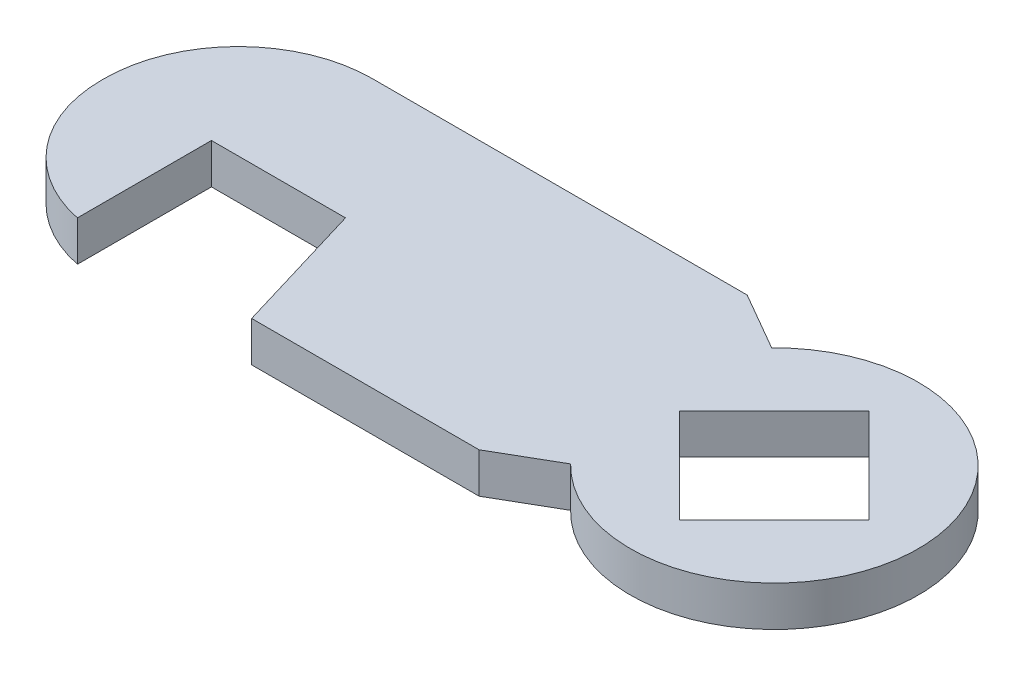
ISO-10303-21;
HEADER;
FILE_DESCRIPTION(('STEP AP214'),'2;1');
FILE_NAME('part.step','',(''),(''),'','','');
FILE_SCHEMA(('AUTOMOTIVE_DESIGN { 1 0 10303 214 1 1 1 1 }'));
ENDSEC;
DATA;
#1=APPLICATION_CONTEXT('core data for automotive mechanical design processes');
#2=APPLICATION_PROTOCOL_DEFINITION('international standard','automotive_design',2000,#1);
#3=PRODUCT_CONTEXT('',#1,'mechanical');
#4=PRODUCT('Part','Part','',(#3));
#5=PRODUCT_RELATED_PRODUCT_CATEGORY('part','',(#4));
#6=PRODUCT_DEFINITION_FORMATION('','',#4);
#7=PRODUCT_DEFINITION_CONTEXT('part definition',#1,'design');
#8=PRODUCT_DEFINITION('design','',#6,#7);
#9=PRODUCT_DEFINITION_SHAPE('','',#8);
#10=(LENGTH_UNIT() NAMED_UNIT(*) SI_UNIT(.MILLI.,.METRE.));
#11=(NAMED_UNIT(*) PLANE_ANGLE_UNIT() SI_UNIT($,.RADIAN.));
#12=(NAMED_UNIT(*) SI_UNIT($,.STERADIAN.) SOLID_ANGLE_UNIT());
#13=UNCERTAINTY_MEASURE_WITH_UNIT(LENGTH_MEASURE(1.E-05),#10,'distance_accuracy_value','');
#14=(GEOMETRIC_REPRESENTATION_CONTEXT(3) GLOBAL_UNCERTAINTY_ASSIGNED_CONTEXT((#13)) GLOBAL_UNIT_ASSIGNED_CONTEXT((#10,
#11,#12)) REPRESENTATION_CONTEXT('',''));
#15=CARTESIAN_POINT('',(0.,0.,0.));
#16=DIRECTION('',(0.,0.,1.));
#17=DIRECTION('',(1.,0.,0.));
#18=AXIS2_PLACEMENT_3D('',#15,#16,#17);
#19=CARTESIAN_POINT('',(-50.,3.,-10.));
#20=DIRECTION('',(1.,0.,0.));
#21=DIRECTION('',(0.,0.,-1.));
#22=AXIS2_PLACEMENT_3D('',#19,#20,#21);
#23=PLANE('',#22);
#24=DIRECTION('',(0.,0.,1.));
#25=VECTOR('',#24,1.);
#26=CARTESIAN_POINT('',(-50.,3.,-10.));
#27=LINE('',#26,#25);
#28=CARTESIAN_POINT('',(-50.,3.,0.));
#29=VERTEX_POINT('',#28);
#30=CARTESIAN_POINT('',(-50.,3.,0.202041028867287));
#31=VERTEX_POINT('',#30);
#32=EDGE_CURVE('E168',#29,#31,#27,.T.);
#33=ORIENTED_EDGE('',*,*,#32,.F.);
#34=DIRECTION('',(0.,-1.,0.));
#35=VECTOR('',#34,1.);
#36=CARTESIAN_POINT('',(-50.,3.,0.));
#37=LINE('',#36,#35);
#38=CARTESIAN_POINT('',(-50.,0.,0.));
#39=VERTEX_POINT('',#38);
#40=EDGE_CURVE('E214',#29,#39,#37,.T.);
#41=ORIENTED_EDGE('',*,*,#40,.T.);
#42=DIRECTION('',(0.,0.,1.));
#43=VECTOR('',#42,1.);
#44=CARTESIAN_POINT('',(-50.,0.,-10.));
#45=LINE('',#44,#43);
#46=CARTESIAN_POINT('',(-50.,0.,0.202041028867287));
#47=VERTEX_POINT('',#46);
#48=EDGE_CURVE('E183',#39,#47,#45,.T.);
#49=ORIENTED_EDGE('',*,*,#48,.T.);
#50=DIRECTION('',(0.,1.,0.));
#51=VECTOR('',#50,1.);
#52=CARTESIAN_POINT('',(-50.,3.,0.202041028867287));
#53=LINE('',#52,#51);
#54=EDGE_CURVE('E212',#47,#31,#53,.T.);
#55=ORIENTED_EDGE('',*,*,#54,.T.);
#56=EDGE_LOOP('',(#33,#41,#49,#55));
#57=FACE_BOUND('',#56,.T.);
#58=ADVANCED_FACE('F33',(#57),#23,.F.);
#59=CARTESIAN_POINT('',(-50.,3.,10.));
#60=DIRECTION('',(0.,0.,-1.));
#61=DIRECTION('',(-1.,0.,0.));
#62=AXIS2_PLACEMENT_3D('',#59,#60,#61);
#63=PLANE('',#62);
#64=DIRECTION('',(1.,0.,0.));
#65=VECTOR('',#64,1.);
#66=CARTESIAN_POINT('',(-50.,3.,10.));
#67=LINE('',#66,#65);
#68=CARTESIAN_POINT('',(-29.,3.,10.));
#69=VERTEX_POINT('',#68);
#70=CARTESIAN_POINT('',(-12.0315879192969,3.,10.));
#71=VERTEX_POINT('',#70);
#72=EDGE_CURVE('E157',#69,#71,#67,.T.);
#73=ORIENTED_EDGE('',*,*,#72,.F.);
#74=DIRECTION('',(0.,1.,0.));
#75=VECTOR('',#74,1.);
#76=CARTESIAN_POINT('',(-29.,-7.,10.));
#77=LINE('',#76,#75);
#78=CARTESIAN_POINT('',(-29.,0.,10.));
#79=VERTEX_POINT('',#78);
#80=EDGE_CURVE('E141',#79,#69,#77,.T.);
#81=ORIENTED_EDGE('',*,*,#80,.F.);
#82=DIRECTION('',(1.,0.,0.));
#83=VECTOR('',#82,1.);
#84=CARTESIAN_POINT('',(-50.,0.,10.));
#85=LINE('',#84,#83);
#86=CARTESIAN_POINT('',(-12.0315879192969,0.,10.));
#87=VERTEX_POINT('',#86);
#88=EDGE_CURVE('E186',#79,#87,#85,.T.);
#89=ORIENTED_EDGE('',*,*,#88,.T.);
#90=DIRECTION('',(0.,-1.,0.));
#91=VECTOR('',#90,1.);
#92=CARTESIAN_POINT('',(-12.0315879192969,3.,10.));
#93=LINE('',#92,#91);
#94=EDGE_CURVE('E165',#71,#87,#93,.T.);
#95=ORIENTED_EDGE('',*,*,#94,.F.);
#96=EDGE_LOOP('',(#73,#81,#89,#95));
#97=FACE_BOUND('',#96,.T.);
#98=ADVANCED_FACE('F163',(#97),#63,.F.);
#99=CARTESIAN_POINT('',(-12.0315879192969,3.,10.));
#100=DIRECTION('',(-0.500000000000001,0.,-0.866025403784438));
#101=DIRECTION('',(-0.866025403784438,0.,0.500000000000001));
#102=AXIS2_PLACEMENT_3D('',#99,#100,#101);
#103=PLANE('',#102);
#104=DIRECTION('',(0.866025403784438,0.,-0.500000000000001));
#105=VECTOR('',#104,1.);
#106=CARTESIAN_POINT('',(-12.0315879192969,0.,10.));
#107=LINE('',#106,#105);
#108=CARTESIAN_POINT('',(-7.70146090037468,0.,7.5));
#109=VERTEX_POINT('',#108);
#110=EDGE_CURVE('E189',#87,#109,#107,.T.);
#111=ORIENTED_EDGE('',*,*,#110,.T.);
#112=DIRECTION('',(0.,-1.,0.));
#113=VECTOR('',#112,1.);
#114=CARTESIAN_POINT('',(-7.70146090037468,3.,7.5));
#115=LINE('',#114,#113);
#116=CARTESIAN_POINT('',(-7.70146090037468,3.,7.5));
#117=VERTEX_POINT('',#116);
#118=EDGE_CURVE('E201',#117,#109,#115,.T.);
#119=ORIENTED_EDGE('',*,*,#118,.F.);
#120=DIRECTION('',(0.866025403784438,0.,-0.500000000000001));
#121=VECTOR('',#120,1.);
#122=CARTESIAN_POINT('',(-12.0315879192969,3.,10.));
#123=LINE('',#122,#121);
#124=EDGE_CURVE('E167',#71,#117,#123,.T.);
#125=ORIENTED_EDGE('',*,*,#124,.F.);
#126=ORIENTED_EDGE('',*,*,#94,.T.);
#127=EDGE_LOOP('',(#111,#119,#125,#126));
#128=FACE_BOUND('',#127,.T.);
#129=ADVANCED_FACE('F300',(#128),#103,.F.);
#130=CARTESIAN_POINT('',(0.,3.,0.));
#131=DIRECTION('',(0.,-1.,0.));
#132=DIRECTION('',(0.,0.,-1.));
#133=AXIS2_PLACEMENT_3D('',#130,#131,#132);
#134=CYLINDRICAL_SURFACE('',#133,10.75);
#135=CARTESIAN_POINT('',(0.,0.,0.));
#136=DIRECTION('',(0.,1.,0.));
#137=DIRECTION('',(0.,0.,1.));
#138=AXIS2_PLACEMENT_3D('',#135,#136,#137);
#139=CIRCLE('',#138,10.75);
#140=CARTESIAN_POINT('',(-7.70146090037468,0.,-7.5));
#141=VERTEX_POINT('',#140);
#142=EDGE_CURVE('E191',#109,#141,#139,.T.);
#143=ORIENTED_EDGE('',*,*,#142,.T.);
#144=DIRECTION('',(0.,-1.,0.));
#145=VECTOR('',#144,1.);
#146=CARTESIAN_POINT('',(-7.70146090037468,3.,-7.5));
#147=LINE('',#146,#145);
#148=CARTESIAN_POINT('',(-7.70146090037468,3.,-7.5));
#149=VERTEX_POINT('',#148);
#150=EDGE_CURVE('E198',#149,#141,#147,.T.);
#151=ORIENTED_EDGE('',*,*,#150,.F.);
#152=CARTESIAN_POINT('',(0.,3.,0.));
#153=DIRECTION('',(0.,1.,0.));
#154=DIRECTION('',(0.,0.,1.));
#155=AXIS2_PLACEMENT_3D('',#152,#153,#154);
#156=CIRCLE('',#155,10.75);
#157=EDGE_CURVE('E170',#117,#149,#156,.T.);
#158=ORIENTED_EDGE('',*,*,#157,.F.);
#159=ORIENTED_EDGE('',*,*,#118,.T.);
#160=EDGE_LOOP('',(#143,#151,#158,#159));
#161=FACE_BOUND('',#160,.T.);
#162=ADVANCED_FACE('F324',(#161),#134,.T.);
#163=CARTESIAN_POINT('',(-12.0315879192969,3.,-10.));
#164=DIRECTION('',(-0.500000000000001,0.,0.866025403784438));
#165=DIRECTION('',(0.866025403784438,0.,0.500000000000001));
#166=AXIS2_PLACEMENT_3D('',#163,#164,#165);
#167=PLANE('',#166);
#168=DIRECTION('',(-0.866025403784438,0.,-0.500000000000001));
#169=VECTOR('',#168,1.);
#170=CARTESIAN_POINT('',(-12.0315879192969,0.,-10.));
#171=LINE('',#170,#169);
#172=CARTESIAN_POINT('',(-12.0315879192969,0.,-10.));
#173=VERTEX_POINT('',#172);
#174=EDGE_CURVE('E193',#141,#173,#171,.T.);
#175=ORIENTED_EDGE('',*,*,#174,.T.);
#176=DIRECTION('',(0.,-1.,0.));
#177=VECTOR('',#176,1.);
#178=CARTESIAN_POINT('',(-12.0315879192969,3.,-10.));
#179=LINE('',#178,#177);
#180=CARTESIAN_POINT('',(-12.0315879192969,3.,-10.));
#181=VERTEX_POINT('',#180);
#182=EDGE_CURVE('E182',#181,#173,#179,.T.);
#183=ORIENTED_EDGE('',*,*,#182,.F.);
#184=DIRECTION('',(-0.866025403784438,0.,-0.500000000000001));
#185=VECTOR('',#184,1.);
#186=CARTESIAN_POINT('',(-12.0315879192969,3.,-10.));
#187=LINE('',#186,#185);
#188=EDGE_CURVE('E178',#149,#181,#187,.T.);
#189=ORIENTED_EDGE('',*,*,#188,.F.);
#190=ORIENTED_EDGE('',*,*,#150,.T.);
#191=EDGE_LOOP('',(#175,#183,#189,#190));
#192=FACE_BOUND('',#191,.T.);
#193=ADVANCED_FACE('F327',(#192),#167,.F.);
#194=CARTESIAN_POINT('',(-50.,3.,-10.));
#195=DIRECTION('',(0.,0.,1.));
#196=DIRECTION('',(1.,0.,0.));
#197=AXIS2_PLACEMENT_3D('',#194,#195,#196);
#198=PLANE('',#197);
#199=DIRECTION('',(-1.,0.,0.));
#200=VECTOR('',#199,1.);
#201=CARTESIAN_POINT('',(-50.,0.,-10.));
#202=LINE('',#201,#200);
#203=CARTESIAN_POINT('',(-40.,0.,-10.));
#204=VERTEX_POINT('',#203);
#205=EDGE_CURVE('E173',#173,#204,#202,.T.);
#206=ORIENTED_EDGE('',*,*,#205,.T.);
#207=DIRECTION('',(0.,-1.,0.));
#208=VECTOR('',#207,1.);
#209=CARTESIAN_POINT('',(-40.,3.,-10.));
#210=LINE('',#209,#208);
#211=CARTESIAN_POINT('',(-40.,3.,-10.));
#212=VERTEX_POINT('',#211);
#213=EDGE_CURVE('E48',#204,#212,#210,.F.);
#214=ORIENTED_EDGE('',*,*,#213,.T.);
#215=DIRECTION('',(-1.,0.,0.));
#216=VECTOR('',#215,1.);
#217=CARTESIAN_POINT('',(-50.,3.,-10.));
#218=LINE('',#217,#216);
#219=EDGE_CURVE('E180',#181,#212,#218,.T.);
#220=ORIENTED_EDGE('',*,*,#219,.F.);
#221=ORIENTED_EDGE('',*,*,#182,.T.);
#222=EDGE_LOOP('',(#206,#214,#220,#221));
#223=FACE_BOUND('',#222,.T.);
#224=ADVANCED_FACE('F328',(#223),#198,.F.);
#225=CARTESIAN_POINT('',(0.,3.,0.));
#226=DIRECTION('',(0.,1.,0.));
#227=DIRECTION('',(0.,0.,1.));
#228=AXIS2_PLACEMENT_3D('',#225,#226,#227);
#229=PLANE('',#228);
#230=ORIENTED_EDGE('',*,*,#219,.T.);
#231=CARTESIAN_POINT('',(-40.,3.,0.));
#232=DIRECTION('',(0.,1.,0.));
#233=DIRECTION('',(0.,0.,1.));
#234=AXIS2_PLACEMENT_3D('',#231,#232,#233);
#235=CIRCLE('',#234,10.);
#236=EDGE_CURVE('E11',#212,#29,#235,.T.);
#237=ORIENTED_EDGE('',*,*,#236,.T.);
#238=ORIENTED_EDGE('',*,*,#32,.T.);
#239=CARTESIAN_POINT('',(-40.,3.,0.202041028867287));
#240=DIRECTION('',(0.,1.,0.));
#241=DIRECTION('',(0.,0.,1.));
#242=AXIS2_PLACEMENT_3D('',#239,#240,#241);
#243=CIRCLE('',#242,10.);
#244=CARTESIAN_POINT('',(-42.,3.,10.));
#245=VERTEX_POINT('',#244);
#246=EDGE_CURVE('E41',#31,#245,#243,.T.);
#247=ORIENTED_EDGE('',*,*,#246,.T.);
#248=DIRECTION('',(0.,0.,1.));
#249=VECTOR('',#248,1.);
#250=CARTESIAN_POINT('',(-42.,3.,10.));
#251=LINE('',#250,#249);
#252=CARTESIAN_POINT('',(-42.,3.,0.));
#253=VERTEX_POINT('',#252);
#254=EDGE_CURVE('E152',#253,#245,#251,.T.);
#255=ORIENTED_EDGE('',*,*,#254,.F.);
#256=DIRECTION('',(-1.,0.,0.));
#257=VECTOR('',#256,1.);
#258=CARTESIAN_POINT('',(-42.,3.,0.));
#259=LINE('',#258,#257);
#260=CARTESIAN_POINT('',(-32.,3.,0.));
#261=VERTEX_POINT('',#260);
#262=EDGE_CURVE('E161',#261,#253,#259,.T.);
#263=ORIENTED_EDGE('',*,*,#262,.F.);
#264=DIRECTION('',(-0.287347885566345,0.,-0.957826285221151));
#265=VECTOR('',#264,1.);
#266=CARTESIAN_POINT('',(-32.,3.,0.));
#267=LINE('',#266,#265);
#268=EDGE_CURVE('E144',#69,#261,#267,.T.);
#269=ORIENTED_EDGE('',*,*,#268,.F.);
#270=ORIENTED_EDGE('',*,*,#72,.T.);
#271=ORIENTED_EDGE('',*,*,#124,.T.);
#272=ORIENTED_EDGE('',*,*,#157,.T.);
#273=ORIENTED_EDGE('',*,*,#188,.T.);
#274=EDGE_LOOP('',(#230,#237,#238,#247,#255,#263,#269,#270,#271,#272,#273));
#275=FACE_BOUND('',#274,.T.);
#276=DIRECTION('',(-0.707106781186548,0.,-0.707106781186548));
#277=VECTOR('',#276,1.);
#278=CARTESIAN_POINT('',(7.07106781186548,3.,0.));
#279=LINE('',#278,#277);
#280=CARTESIAN_POINT('',(7.07106781186548,3.,0.));
#281=VERTEX_POINT('',#280);
#282=CARTESIAN_POINT('',(0.,3.,-7.07106781186548));
#283=VERTEX_POINT('',#282);
#284=EDGE_CURVE('E233',#281,#283,#279,.T.);
#285=ORIENTED_EDGE('',*,*,#284,.F.);
#286=DIRECTION('',(0.707106781186548,0.,-0.707106781186548));
#287=VECTOR('',#286,1.);
#288=CARTESIAN_POINT('',(0.,3.,7.07106781186547));
#289=LINE('',#288,#287);
#290=CARTESIAN_POINT('',(0.,3.,7.07106781186547));
#291=VERTEX_POINT('',#290);
#292=EDGE_CURVE('E245',#291,#281,#289,.T.);
#293=ORIENTED_EDGE('',*,*,#292,.F.);
#294=DIRECTION('',(0.707106781186548,0.,0.707106781186548));
#295=VECTOR('',#294,1.);
#296=CARTESIAN_POINT('',(-7.07106781186548,3.,0.));
#297=LINE('',#296,#295);
#298=CARTESIAN_POINT('',(-7.07106781186548,3.,0.));
#299=VERTEX_POINT('',#298);
#300=EDGE_CURVE('E257',#299,#291,#297,.T.);
#301=ORIENTED_EDGE('',*,*,#300,.F.);
#302=DIRECTION('',(-0.707106781186548,0.,0.707106781186548));
#303=VECTOR('',#302,1.);
#304=CARTESIAN_POINT('',(0.,3.,-7.07106781186548));
#305=LINE('',#304,#303);
#306=EDGE_CURVE('E235',#283,#299,#305,.T.);
#307=ORIENTED_EDGE('',*,*,#306,.F.);
#308=EDGE_LOOP('',(#285,#293,#301,#307));
#309=FACE_BOUND('',#308,.T.);
#310=ADVANCED_FACE('F155',(#275,#309),#229,.T.);
#311=CARTESIAN_POINT('',(0.,0.,0.));
#312=DIRECTION('',(0.,1.,0.));
#313=DIRECTION('',(0.,0.,1.));
#314=AXIS2_PLACEMENT_3D('',#311,#312,#313);
#315=PLANE('',#314);
#316=DIRECTION('',(0.707106781186548,0.,-0.707106781186548));
#317=VECTOR('',#316,1.);
#318=CARTESIAN_POINT('',(0.,0.,7.07106781186547));
#319=LINE('',#318,#317);
#320=CARTESIAN_POINT('',(0.,0.,7.07106781186547));
#321=VERTEX_POINT('',#320);
#322=CARTESIAN_POINT('',(7.07106781186548,0.,0.));
#323=VERTEX_POINT('',#322);
#324=EDGE_CURVE('E251',#321,#323,#319,.T.);
#325=ORIENTED_EDGE('',*,*,#324,.T.);
#326=DIRECTION('',(-0.707106781186548,0.,-0.707106781186548));
#327=VECTOR('',#326,1.);
#328=CARTESIAN_POINT('',(7.07106781186548,0.,0.));
#329=LINE('',#328,#327);
#330=CARTESIAN_POINT('',(0.,0.,-7.07106781186548));
#331=VERTEX_POINT('',#330);
#332=EDGE_CURVE('E241',#323,#331,#329,.T.);
#333=ORIENTED_EDGE('',*,*,#332,.T.);
#334=DIRECTION('',(-0.707106781186548,0.,0.707106781186548));
#335=VECTOR('',#334,1.);
#336=CARTESIAN_POINT('',(0.,0.,-7.07106781186548));
#337=LINE('',#336,#335);
#338=CARTESIAN_POINT('',(-7.07106781186548,0.,0.));
#339=VERTEX_POINT('',#338);
#340=EDGE_CURVE('E244',#331,#339,#337,.T.);
#341=ORIENTED_EDGE('',*,*,#340,.T.);
#342=DIRECTION('',(0.707106781186548,0.,0.707106781186548));
#343=VECTOR('',#342,1.);
#344=CARTESIAN_POINT('',(-7.07106781186548,0.,0.));
#345=LINE('',#344,#343);
#346=EDGE_CURVE('E248',#339,#321,#345,.T.);
#347=ORIENTED_EDGE('',*,*,#346,.T.);
#348=EDGE_LOOP('',(#325,#333,#341,#347));
#349=FACE_BOUND('',#348,.T.);
#350=ORIENTED_EDGE('',*,*,#48,.F.);
#351=CARTESIAN_POINT('',(-40.,0.,0.));
#352=DIRECTION('',(0.,1.,0.));
#353=DIRECTION('',(0.,0.,1.));
#354=AXIS2_PLACEMENT_3D('',#351,#352,#353);
#355=CIRCLE('',#354,10.);
#356=EDGE_CURVE('E56',#39,#204,#355,.F.);
#357=ORIENTED_EDGE('',*,*,#356,.T.);
#358=ORIENTED_EDGE('',*,*,#205,.F.);
#359=ORIENTED_EDGE('',*,*,#174,.F.);
#360=ORIENTED_EDGE('',*,*,#142,.F.);
#361=ORIENTED_EDGE('',*,*,#110,.F.);
#362=ORIENTED_EDGE('',*,*,#88,.F.);
#363=DIRECTION('',(-0.287347885566345,0.,-0.957826285221152));
#364=VECTOR('',#363,1.);
#365=CARTESIAN_POINT('',(-29.3577981651376,0.,8.80733944954128));
#366=LINE('',#365,#364);
#367=CARTESIAN_POINT('',(-32.,0.,0.));
#368=VERTEX_POINT('',#367);
#369=EDGE_CURVE('E147',#79,#368,#366,.T.);
#370=ORIENTED_EDGE('',*,*,#369,.T.);
#371=DIRECTION('',(-1.,0.,0.));
#372=VECTOR('',#371,1.);
#373=CARTESIAN_POINT('',(0.,0.,0.));
#374=LINE('',#373,#372);
#375=CARTESIAN_POINT('',(-42.,0.,0.));
#376=VERTEX_POINT('',#375);
#377=EDGE_CURVE('E206',#368,#376,#374,.T.);
#378=ORIENTED_EDGE('',*,*,#377,.T.);
#379=DIRECTION('',(0.,0.,1.));
#380=VECTOR('',#379,1.);
#381=CARTESIAN_POINT('',(-42.,0.,0.));
#382=LINE('',#381,#380);
#383=CARTESIAN_POINT('',(-42.,0.,10.));
#384=VERTEX_POINT('',#383);
#385=EDGE_CURVE('E209',#376,#384,#382,.T.);
#386=ORIENTED_EDGE('',*,*,#385,.T.);
#387=CARTESIAN_POINT('',(-40.,0.,0.202041028867287));
#388=DIRECTION('',(0.,1.,0.));
#389=DIRECTION('',(0.,0.,1.));
#390=AXIS2_PLACEMENT_3D('',#387,#388,#389);
#391=CIRCLE('',#390,10.);
#392=EDGE_CURVE('E217',#384,#47,#391,.F.);
#393=ORIENTED_EDGE('',*,*,#392,.T.);
#394=EDGE_LOOP('',(#350,#357,#358,#359,#360,#361,#362,#370,#378,#386,#393));
#395=FACE_BOUND('',#394,.T.);
#396=ADVANCED_FACE('F281',(#349,#395),#315,.F.);
#397=CARTESIAN_POINT('',(7.07106781186548,0.,0.));
#398=DIRECTION('',(0.707106781186547,0.,-0.707106781186547));
#399=DIRECTION('',(-0.707106781186548,0.,-0.707106781186548));
#400=AXIS2_PLACEMENT_3D('',#397,#398,#399);
#401=PLANE('',#400);
#402=ORIENTED_EDGE('',*,*,#284,.T.);
#403=DIRECTION('',(0.,1.,0.));
#404=VECTOR('',#403,1.);
#405=CARTESIAN_POINT('',(0.,0.,-7.07106781186548));
#406=LINE('',#405,#404);
#407=EDGE_CURVE('E253',#331,#283,#406,.T.);
#408=ORIENTED_EDGE('',*,*,#407,.F.);
#409=ORIENTED_EDGE('',*,*,#332,.F.);
#410=DIRECTION('',(0.,1.,0.));
#411=VECTOR('',#410,1.);
#412=CARTESIAN_POINT('',(7.07106781186548,0.,0.));
#413=LINE('',#412,#411);
#414=EDGE_CURVE('E187',#323,#281,#413,.T.);
#415=ORIENTED_EDGE('',*,*,#414,.T.);
#416=EDGE_LOOP('',(#402,#408,#409,#415));
#417=FACE_BOUND('',#416,.T.);
#418=ADVANCED_FACE('F282',(#417),#401,.F.);
#419=CARTESIAN_POINT('',(0.,0.,7.07106781186547));
#420=DIRECTION('',(0.707106781186547,0.,0.707106781186547));
#421=DIRECTION('',(0.707106781186548,0.,-0.707106781186548));
#422=AXIS2_PLACEMENT_3D('',#419,#420,#421);
#423=PLANE('',#422);
#424=ORIENTED_EDGE('',*,*,#292,.T.);
#425=ORIENTED_EDGE('',*,*,#414,.F.);
#426=ORIENTED_EDGE('',*,*,#324,.F.);
#427=DIRECTION('',(0.,1.,0.));
#428=VECTOR('',#427,1.);
#429=CARTESIAN_POINT('',(0.,0.,7.07106781186547));
#430=LINE('',#429,#428);
#431=EDGE_CURVE('E263',#321,#291,#430,.T.);
#432=ORIENTED_EDGE('',*,*,#431,.T.);
#433=EDGE_LOOP('',(#424,#425,#426,#432));
#434=FACE_BOUND('',#433,.T.);
#435=ADVANCED_FACE('F284',(#434),#423,.F.);
#436=CARTESIAN_POINT('',(-7.07106781186548,0.,0.));
#437=DIRECTION('',(-0.707106781186547,0.,0.707106781186547));
#438=DIRECTION('',(0.707106781186548,0.,0.707106781186548));
#439=AXIS2_PLACEMENT_3D('',#436,#437,#438);
#440=PLANE('',#439);
#441=ORIENTED_EDGE('',*,*,#300,.T.);
#442=ORIENTED_EDGE('',*,*,#431,.F.);
#443=ORIENTED_EDGE('',*,*,#346,.F.);
#444=DIRECTION('',(0.,1.,0.));
#445=VECTOR('',#444,1.);
#446=CARTESIAN_POINT('',(-7.07106781186548,0.,0.));
#447=LINE('',#446,#445);
#448=EDGE_CURVE('E265',#339,#299,#447,.T.);
#449=ORIENTED_EDGE('',*,*,#448,.T.);
#450=EDGE_LOOP('',(#441,#442,#443,#449));
#451=FACE_BOUND('',#450,.T.);
#452=ADVANCED_FACE('F278',(#451),#440,.F.);
#453=CARTESIAN_POINT('',(0.,0.,-7.07106781186548));
#454=DIRECTION('',(-0.707106781186547,0.,-0.707106781186547));
#455=DIRECTION('',(-0.707106781186548,0.,0.707106781186548));
#456=AXIS2_PLACEMENT_3D('',#453,#454,#455);
#457=PLANE('',#456);
#458=ORIENTED_EDGE('',*,*,#306,.T.);
#459=ORIENTED_EDGE('',*,*,#448,.F.);
#460=ORIENTED_EDGE('',*,*,#340,.F.);
#461=ORIENTED_EDGE('',*,*,#407,.T.);
#462=EDGE_LOOP('',(#458,#459,#460,#461));
#463=FACE_BOUND('',#462,.T.);
#464=ADVANCED_FACE('F270',(#463),#457,.F.);
#465=CARTESIAN_POINT('',(-42.,-7.,10.));
#466=DIRECTION('',(-1.,0.,0.));
#467=DIRECTION('',(0.,0.,1.));
#468=AXIS2_PLACEMENT_3D('',#465,#466,#467);
#469=PLANE('',#468);
#470=DIRECTION('',(0.,1.,0.));
#471=VECTOR('',#470,1.);
#472=CARTESIAN_POINT('',(-42.,-7.,0.));
#473=LINE('',#472,#471);
#474=EDGE_CURVE('E231',#376,#253,#473,.T.);
#475=ORIENTED_EDGE('',*,*,#474,.T.);
#476=ORIENTED_EDGE('',*,*,#254,.T.);
#477=DIRECTION('',(0.,1.,0.));
#478=VECTOR('',#477,1.);
#479=CARTESIAN_POINT('',(-42.,-7.,10.));
#480=LINE('',#479,#478);
#481=EDGE_CURVE('E229',#384,#245,#480,.T.);
#482=ORIENTED_EDGE('',*,*,#481,.F.);
#483=ORIENTED_EDGE('',*,*,#385,.F.);
#484=EDGE_LOOP('',(#475,#476,#482,#483));
#485=FACE_BOUND('',#484,.T.);
#486=ADVANCED_FACE('F228',(#485),#469,.F.);
#487=CARTESIAN_POINT('',(-42.,-7.,0.));
#488=DIRECTION('',(0.,0.,-1.));
#489=DIRECTION('',(-1.,0.,0.));
#490=AXIS2_PLACEMENT_3D('',#487,#488,#489);
#491=PLANE('',#490);
#492=DIRECTION('',(0.,1.,0.));
#493=VECTOR('',#492,1.);
#494=CARTESIAN_POINT('',(-32.,-7.,0.));
#495=LINE('',#494,#493);
#496=EDGE_CURVE('E151',#368,#261,#495,.T.);
#497=ORIENTED_EDGE('',*,*,#496,.T.);
#498=ORIENTED_EDGE('',*,*,#262,.T.);
#499=ORIENTED_EDGE('',*,*,#474,.F.);
#500=ORIENTED_EDGE('',*,*,#377,.F.);
#501=EDGE_LOOP('',(#497,#498,#499,#500));
#502=FACE_BOUND('',#501,.T.);
#503=ADVANCED_FACE('F310',(#502),#491,.F.);
#504=CARTESIAN_POINT('',(-32.,-7.,0.));
#505=DIRECTION('',(0.957826285221152,0.,-0.287347885566345));
#506=DIRECTION('',(-0.287347885566345,0.,-0.957826285221152));
#507=AXIS2_PLACEMENT_3D('',#504,#505,#506);
#508=PLANE('',#507);
#509=ORIENTED_EDGE('',*,*,#80,.T.);
#510=ORIENTED_EDGE('',*,*,#268,.T.);
#511=ORIENTED_EDGE('',*,*,#496,.F.);
#512=ORIENTED_EDGE('',*,*,#369,.F.);
#513=EDGE_LOOP('',(#509,#510,#511,#512));
#514=FACE_BOUND('',#513,.T.);
#515=ADVANCED_FACE('F143',(#514),#508,.F.);
#516=CARTESIAN_POINT('',(-40.,3.,0.));
#517=DIRECTION('',(0.,-1.,0.));
#518=DIRECTION('',(0.,0.,-1.));
#519=AXIS2_PLACEMENT_3D('',#516,#517,#518);
#520=CYLINDRICAL_SURFACE('',#519,10.);
#521=ORIENTED_EDGE('',*,*,#236,.F.);
#522=ORIENTED_EDGE('',*,*,#213,.F.);
#523=ORIENTED_EDGE('',*,*,#356,.F.);
#524=ORIENTED_EDGE('',*,*,#40,.F.);
#525=EDGE_LOOP('',(#521,#522,#523,#524));
#526=FACE_BOUND('',#525,.T.);
#527=ADVANCED_FACE('F303',(#526),#520,.T.);
#528=CARTESIAN_POINT('',(-40.,3.,0.202041028867287));
#529=DIRECTION('',(0.,1.,0.));
#530=DIRECTION('',(0.,0.,1.));
#531=AXIS2_PLACEMENT_3D('',#528,#529,#530);
#532=CYLINDRICAL_SURFACE('',#531,10.);
#533=ORIENTED_EDGE('',*,*,#246,.F.);
#534=ORIENTED_EDGE('',*,*,#54,.F.);
#535=ORIENTED_EDGE('',*,*,#392,.F.);
#536=ORIENTED_EDGE('',*,*,#481,.T.);
#537=EDGE_LOOP('',(#533,#534,#535,#536));
#538=FACE_BOUND('',#537,.T.);
#539=ADVANCED_FACE('F35',(#538),#532,.T.);
#540=CLOSED_SHELL('',(#58,#98,#129,#162,#193,#224,#310,#396,#418,#435,#452,#464,#486,#503,#515,
#527,#539));
#541=MANIFOLD_SOLID_BREP('B2',#540);
#542=ADVANCED_BREP_SHAPE_REPRESENTATION('',(#18,#541),#14);
#543=SHAPE_DEFINITION_REPRESENTATION(#9,#542);
ENDSEC;
END-ISO-10303-21;
